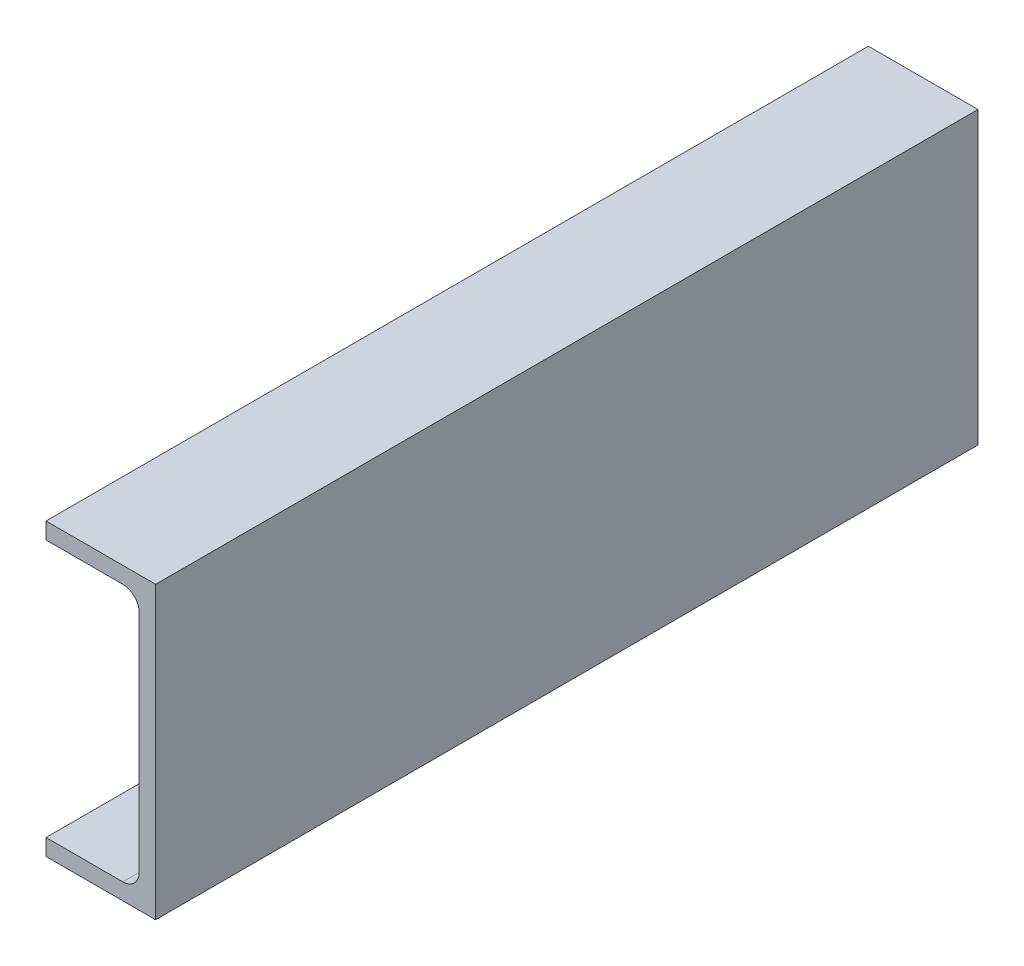
ISO-10303-21;
HEADER;
FILE_DESCRIPTION(('STEP AP214'),'2;1');
FILE_NAME('part.step','',(''),(''),'','','');
FILE_SCHEMA(('AUTOMOTIVE_DESIGN { 1 0 10303 214 1 1 1 1 }'));
ENDSEC;
DATA;
#1=APPLICATION_CONTEXT('core data for automotive mechanical design processes');
#2=APPLICATION_PROTOCOL_DEFINITION('international standard','automotive_design',2000,#1);
#3=PRODUCT_CONTEXT('',#1,'mechanical');
#4=PRODUCT('Part','Part','',(#3));
#5=PRODUCT_RELATED_PRODUCT_CATEGORY('part','',(#4));
#6=PRODUCT_DEFINITION_FORMATION('','',#4);
#7=PRODUCT_DEFINITION_CONTEXT('part definition',#1,'design');
#8=PRODUCT_DEFINITION('design','',#6,#7);
#9=PRODUCT_DEFINITION_SHAPE('','',#8);
#10=(LENGTH_UNIT() NAMED_UNIT(*) SI_UNIT(.MILLI.,.METRE.));
#11=(NAMED_UNIT(*) PLANE_ANGLE_UNIT() SI_UNIT($,.RADIAN.));
#12=(NAMED_UNIT(*) SI_UNIT($,.STERADIAN.) SOLID_ANGLE_UNIT());
#13=UNCERTAINTY_MEASURE_WITH_UNIT(LENGTH_MEASURE(1.E-05),#10,'distance_accuracy_value','');
#14=(GEOMETRIC_REPRESENTATION_CONTEXT(3) GLOBAL_UNCERTAINTY_ASSIGNED_CONTEXT((#13)) GLOBAL_UNIT_ASSIGNED_CONTEXT((#10,
#11,#12)) REPRESENTATION_CONTEXT('',''));
#15=CARTESIAN_POINT('',(0.,0.,0.));
#16=DIRECTION('',(0.,0.,1.));
#17=DIRECTION('',(1.,0.,0.));
#18=AXIS2_PLACEMENT_3D('',#15,#16,#17);
#19=CARTESIAN_POINT('',(20.,53.,75.));
#20=DIRECTION('',(0.,-1.,0.));
#21=DIRECTION('',(0.,0.,-1.));
#22=AXIS2_PLACEMENT_3D('',#19,#20,#21);
#23=PLANE('',#22);
#24=DIRECTION('',(-1.,0.,0.));
#25=VECTOR('',#24,1.);
#26=CARTESIAN_POINT('',(20.,53.,-75.));
#27=LINE('',#26,#25);
#28=CARTESIAN_POINT('',(20.,53.,-75.));
#29=VERTEX_POINT('',#28);
#30=CARTESIAN_POINT('',(0.,53.,-75.));
#31=VERTEX_POINT('',#30);
#32=EDGE_CURVE('E126',#29,#31,#27,.T.);
#33=ORIENTED_EDGE('',*,*,#32,.T.);
#34=DIRECTION('',(0.,0.,-1.));
#35=VECTOR('',#34,1.);
#36=CARTESIAN_POINT('',(0.,53.,75.));
#37=LINE('',#36,#35);
#38=CARTESIAN_POINT('',(0.,53.,75.));
#39=VERTEX_POINT('',#38);
#40=EDGE_CURVE('E124',#39,#31,#37,.T.);
#41=ORIENTED_EDGE('',*,*,#40,.F.);
#42=DIRECTION('',(-1.,0.,0.));
#43=VECTOR('',#42,1.);
#44=CARTESIAN_POINT('',(20.,53.,75.));
#45=LINE('',#44,#43);
#46=CARTESIAN_POINT('',(20.,53.,75.));
#47=VERTEX_POINT('',#46);
#48=EDGE_CURVE('E110',#47,#39,#45,.T.);
#49=ORIENTED_EDGE('',*,*,#48,.F.);
#50=DIRECTION('',(0.,0.,-1.));
#51=VECTOR('',#50,1.);
#52=CARTESIAN_POINT('',(20.,53.,75.));
#53=LINE('',#52,#51);
#54=EDGE_CURVE('E151',#47,#29,#53,.T.);
#55=ORIENTED_EDGE('',*,*,#54,.T.);
#56=EDGE_LOOP('',(#33,#41,#49,#55));
#57=FACE_BOUND('',#56,.T.);
#58=ADVANCED_FACE('F34',(#57),#23,.F.);
#59=CARTESIAN_POINT('',(0.,50.,75.));
#60=DIRECTION('',(-1.,0.,0.));
#61=DIRECTION('',(0.,0.,1.));
#62=AXIS2_PLACEMENT_3D('',#59,#60,#61);
#63=PLANE('',#62);
#64=DIRECTION('',(0.,1.,0.));
#65=VECTOR('',#64,1.);
#66=CARTESIAN_POINT('',(0.,50.,-75.));
#67=LINE('',#66,#65);
#68=CARTESIAN_POINT('',(0.,50.,-75.));
#69=VERTEX_POINT('',#68);
#70=EDGE_CURVE('E153',#69,#31,#67,.T.);
#71=ORIENTED_EDGE('',*,*,#70,.F.);
#72=DIRECTION('',(0.,0.,-1.));
#73=VECTOR('',#72,1.);
#74=CARTESIAN_POINT('',(0.,50.,75.));
#75=LINE('',#74,#73);
#76=CARTESIAN_POINT('',(0.,50.,75.));
#77=VERTEX_POINT('',#76);
#78=EDGE_CURVE('E131',#77,#69,#75,.T.);
#79=ORIENTED_EDGE('',*,*,#78,.F.);
#80=DIRECTION('',(0.,1.,0.));
#81=VECTOR('',#80,1.);
#82=CARTESIAN_POINT('',(0.,50.,75.));
#83=LINE('',#82,#81);
#84=EDGE_CURVE('E115',#77,#39,#83,.T.);
#85=ORIENTED_EDGE('',*,*,#84,.T.);
#86=ORIENTED_EDGE('',*,*,#40,.T.);
#87=EDGE_LOOP('',(#71,#79,#85,#86));
#88=FACE_BOUND('',#87,.T.);
#89=ADVANCED_FACE('F134',(#88),#63,.T.);
#90=CARTESIAN_POINT('',(20.,50.,75.));
#91=DIRECTION('',(0.,-1.,0.));
#92=DIRECTION('',(0.,0.,-1.));
#93=AXIS2_PLACEMENT_3D('',#90,#91,#92);
#94=PLANE('',#93);
#95=DIRECTION('',(1.,0.,0.));
#96=VECTOR('',#95,1.);
#97=CARTESIAN_POINT('',(20.,50.,-75.));
#98=LINE('',#97,#96);
#99=CARTESIAN_POINT('',(14.,50.,-75.));
#100=VERTEX_POINT('',#99);
#101=EDGE_CURVE('E155',#100,#69,#98,.F.);
#102=ORIENTED_EDGE('',*,*,#101,.F.);
#103=DIRECTION('',(0.,0.,-1.));
#104=VECTOR('',#103,1.);
#105=CARTESIAN_POINT('',(14.,50.,75.));
#106=LINE('',#105,#104);
#107=CARTESIAN_POINT('',(14.,50.,75.));
#108=VERTEX_POINT('',#107);
#109=EDGE_CURVE('E182',#100,#108,#106,.F.);
#110=ORIENTED_EDGE('',*,*,#109,.T.);
#111=DIRECTION('',(1.,0.,0.));
#112=VECTOR('',#111,1.);
#113=CARTESIAN_POINT('',(20.,50.,75.));
#114=LINE('',#113,#112);
#115=EDGE_CURVE('E136',#108,#77,#114,.F.);
#116=ORIENTED_EDGE('',*,*,#115,.T.);
#117=ORIENTED_EDGE('',*,*,#78,.T.);
#118=EDGE_LOOP('',(#102,#110,#116,#117));
#119=FACE_BOUND('',#118,.T.);
#120=ADVANCED_FACE('F213',(#119),#94,.T.);
#121=CARTESIAN_POINT('',(17.,0.,75.));
#122=DIRECTION('',(-1.,0.,0.));
#123=DIRECTION('',(0.,0.,1.));
#124=AXIS2_PLACEMENT_3D('',#121,#122,#123);
#125=PLANE('',#124);
#126=DIRECTION('',(0.,1.,0.));
#127=VECTOR('',#126,1.);
#128=CARTESIAN_POINT('',(17.,0.,75.));
#129=LINE('',#128,#127);
#130=CARTESIAN_POINT('',(17.,6.,75.));
#131=VERTEX_POINT('',#130);
#132=CARTESIAN_POINT('',(17.,47.,75.));
#133=VERTEX_POINT('',#132);
#134=EDGE_CURVE('E138',#131,#133,#129,.T.);
#135=ORIENTED_EDGE('',*,*,#134,.T.);
#136=DIRECTION('',(0.,0.,-1.));
#137=VECTOR('',#136,1.);
#138=CARTESIAN_POINT('',(17.,47.,-75.));
#139=LINE('',#138,#137);
#140=CARTESIAN_POINT('',(17.,47.,-75.));
#141=VERTEX_POINT('',#140);
#142=EDGE_CURVE('E179',#133,#141,#139,.T.);
#143=ORIENTED_EDGE('',*,*,#142,.T.);
#144=DIRECTION('',(0.,1.,0.));
#145=VECTOR('',#144,1.);
#146=CARTESIAN_POINT('',(17.,0.,-75.));
#147=LINE('',#146,#145);
#148=CARTESIAN_POINT('',(17.,6.,-75.));
#149=VERTEX_POINT('',#148);
#150=EDGE_CURVE('E157',#149,#141,#147,.T.);
#151=ORIENTED_EDGE('',*,*,#150,.F.);
#152=DIRECTION('',(0.,0.,-1.));
#153=VECTOR('',#152,1.);
#154=CARTESIAN_POINT('',(17.,6.,75.));
#155=LINE('',#154,#153);
#156=EDGE_CURVE('E130',#149,#131,#155,.F.);
#157=ORIENTED_EDGE('',*,*,#156,.T.);
#158=EDGE_LOOP('',(#135,#143,#151,#157));
#159=FACE_BOUND('',#158,.T.);
#160=ADVANCED_FACE('F194',(#159),#125,.T.);
#161=CARTESIAN_POINT('',(0.,3.,75.));
#162=DIRECTION('',(0.,1.,0.));
#163=DIRECTION('',(0.,0.,1.));
#164=AXIS2_PLACEMENT_3D('',#161,#162,#163);
#165=PLANE('',#164);
#166=DIRECTION('',(1.,0.,0.));
#167=VECTOR('',#166,1.);
#168=CARTESIAN_POINT('',(0.,3.,75.));
#169=LINE('',#168,#167);
#170=CARTESIAN_POINT('',(0.,3.,75.));
#171=VERTEX_POINT('',#170);
#172=CARTESIAN_POINT('',(14.,3.,75.));
#173=VERTEX_POINT('',#172);
#174=EDGE_CURVE('E143',#171,#173,#169,.T.);
#175=ORIENTED_EDGE('',*,*,#174,.T.);
#176=DIRECTION('',(0.,0.,-1.));
#177=VECTOR('',#176,1.);
#178=CARTESIAN_POINT('',(14.,3.,-75.));
#179=LINE('',#178,#177);
#180=CARTESIAN_POINT('',(14.,3.,-75.));
#181=VERTEX_POINT('',#180);
#182=EDGE_CURVE('E184',#173,#181,#179,.T.);
#183=ORIENTED_EDGE('',*,*,#182,.T.);
#184=DIRECTION('',(1.,0.,0.));
#185=VECTOR('',#184,1.);
#186=CARTESIAN_POINT('',(0.,3.,-75.));
#187=LINE('',#186,#185);
#188=CARTESIAN_POINT('',(0.,3.,-75.));
#189=VERTEX_POINT('',#188);
#190=EDGE_CURVE('E160',#189,#181,#187,.T.);
#191=ORIENTED_EDGE('',*,*,#190,.F.);
#192=DIRECTION('',(0.,0.,-1.));
#193=VECTOR('',#192,1.);
#194=CARTESIAN_POINT('',(0.,3.,75.));
#195=LINE('',#194,#193);
#196=EDGE_CURVE('E175',#171,#189,#195,.T.);
#197=ORIENTED_EDGE('',*,*,#196,.F.);
#198=EDGE_LOOP('',(#175,#183,#191,#197));
#199=FACE_BOUND('',#198,.T.);
#200=ADVANCED_FACE('F197',(#199),#165,.T.);
#201=CARTESIAN_POINT('',(0.,0.,75.));
#202=DIRECTION('',(-1.,0.,0.));
#203=DIRECTION('',(0.,0.,1.));
#204=AXIS2_PLACEMENT_3D('',#201,#202,#203);
#205=PLANE('',#204);
#206=DIRECTION('',(0.,1.,0.));
#207=VECTOR('',#206,1.);
#208=CARTESIAN_POINT('',(0.,0.,-75.));
#209=LINE('',#208,#207);
#210=CARTESIAN_POINT('',(0.,0.,-75.));
#211=VERTEX_POINT('',#210);
#212=EDGE_CURVE('E163',#211,#189,#209,.T.);
#213=ORIENTED_EDGE('',*,*,#212,.F.);
#214=DIRECTION('',(0.,0.,-1.));
#215=VECTOR('',#214,1.);
#216=CARTESIAN_POINT('',(0.,0.,75.));
#217=LINE('',#216,#215);
#218=CARTESIAN_POINT('',(0.,0.,75.));
#219=VERTEX_POINT('',#218);
#220=EDGE_CURVE('E173',#219,#211,#217,.T.);
#221=ORIENTED_EDGE('',*,*,#220,.F.);
#222=DIRECTION('',(0.,1.,0.));
#223=VECTOR('',#222,1.);
#224=CARTESIAN_POINT('',(0.,0.,75.));
#225=LINE('',#224,#223);
#226=EDGE_CURVE('E145',#219,#171,#225,.T.);
#227=ORIENTED_EDGE('',*,*,#226,.T.);
#228=ORIENTED_EDGE('',*,*,#196,.T.);
#229=EDGE_LOOP('',(#213,#221,#227,#228));
#230=FACE_BOUND('',#229,.T.);
#231=ADVANCED_FACE('F201',(#230),#205,.T.);
#232=CARTESIAN_POINT('',(0.,0.,75.));
#233=DIRECTION('',(0.,1.,0.));
#234=DIRECTION('',(0.,0.,1.));
#235=AXIS2_PLACEMENT_3D('',#232,#233,#234);
#236=PLANE('',#235);
#237=DIRECTION('',(1.,0.,0.));
#238=VECTOR('',#237,1.);
#239=CARTESIAN_POINT('',(0.,0.,-75.));
#240=LINE('',#239,#238);
#241=CARTESIAN_POINT('',(20.,0.,-75.));
#242=VERTEX_POINT('',#241);
#243=EDGE_CURVE('E166',#211,#242,#240,.T.);
#244=ORIENTED_EDGE('',*,*,#243,.T.);
#245=DIRECTION('',(0.,0.,-1.));
#246=VECTOR('',#245,1.);
#247=CARTESIAN_POINT('',(20.,0.,75.));
#248=LINE('',#247,#246);
#249=CARTESIAN_POINT('',(20.,0.,75.));
#250=VERTEX_POINT('',#249);
#251=EDGE_CURVE('E170',#250,#242,#248,.T.);
#252=ORIENTED_EDGE('',*,*,#251,.F.);
#253=DIRECTION('',(1.,0.,0.));
#254=VECTOR('',#253,1.);
#255=CARTESIAN_POINT('',(0.,0.,75.));
#256=LINE('',#255,#254);
#257=EDGE_CURVE('E148',#219,#250,#256,.T.);
#258=ORIENTED_EDGE('',*,*,#257,.F.);
#259=ORIENTED_EDGE('',*,*,#220,.T.);
#260=EDGE_LOOP('',(#244,#252,#258,#259));
#261=FACE_BOUND('',#260,.T.);
#262=ADVANCED_FACE('F206',(#261),#236,.F.);
#263=CARTESIAN_POINT('',(20.,0.,75.));
#264=DIRECTION('',(-1.,0.,0.));
#265=DIRECTION('',(0.,0.,1.));
#266=AXIS2_PLACEMENT_3D('',#263,#264,#265);
#267=PLANE('',#266);
#268=DIRECTION('',(0.,1.,0.));
#269=VECTOR('',#268,1.);
#270=CARTESIAN_POINT('',(20.,0.,-75.));
#271=LINE('',#270,#269);
#272=EDGE_CURVE('E121',#242,#29,#271,.T.);
#273=ORIENTED_EDGE('',*,*,#272,.T.);
#274=ORIENTED_EDGE('',*,*,#54,.F.);
#275=DIRECTION('',(0.,1.,0.));
#276=VECTOR('',#275,1.);
#277=CARTESIAN_POINT('',(20.,0.,75.));
#278=LINE('',#277,#276);
#279=EDGE_CURVE('E117',#250,#47,#278,.T.);
#280=ORIENTED_EDGE('',*,*,#279,.F.);
#281=ORIENTED_EDGE('',*,*,#251,.T.);
#282=EDGE_LOOP('',(#273,#274,#280,#281));
#283=FACE_BOUND('',#282,.T.);
#284=ADVANCED_FACE('F209',(#283),#267,.F.);
#285=CARTESIAN_POINT('',(0.,0.,75.));
#286=DIRECTION('',(0.,0.,-1.));
#287=DIRECTION('',(-1.,0.,0.));
#288=AXIS2_PLACEMENT_3D('',#285,#286,#287);
#289=PLANE('',#288);
#290=ORIENTED_EDGE('',*,*,#48,.T.);
#291=ORIENTED_EDGE('',*,*,#84,.F.);
#292=ORIENTED_EDGE('',*,*,#115,.F.);
#293=CARTESIAN_POINT('',(14.,47.,75.));
#294=DIRECTION('',(0.,0.,-1.));
#295=DIRECTION('',(-1.,0.,0.));
#296=AXIS2_PLACEMENT_3D('',#293,#294,#295);
#297=CIRCLE('',#296,3.);
#298=EDGE_CURVE('E188',#108,#133,#297,.T.);
#299=ORIENTED_EDGE('',*,*,#298,.T.);
#300=ORIENTED_EDGE('',*,*,#134,.F.);
#301=CARTESIAN_POINT('',(14.,6.,75.));
#302=DIRECTION('',(0.,0.,-1.));
#303=DIRECTION('',(-1.,0.,0.));
#304=AXIS2_PLACEMENT_3D('',#301,#302,#303);
#305=CIRCLE('',#304,3.);
#306=EDGE_CURVE('E11',#131,#173,#305,.T.);
#307=ORIENTED_EDGE('',*,*,#306,.T.);
#308=ORIENTED_EDGE('',*,*,#174,.F.);
#309=ORIENTED_EDGE('',*,*,#226,.F.);
#310=ORIENTED_EDGE('',*,*,#257,.T.);
#311=ORIENTED_EDGE('',*,*,#279,.T.);
#312=EDGE_LOOP('',(#290,#291,#292,#299,#300,#307,#308,#309,#310,#311));
#313=FACE_BOUND('',#312,.T.);
#314=ADVANCED_FACE('F112',(#313),#289,.F.);
#315=CARTESIAN_POINT('',(0.,0.,-75.));
#316=DIRECTION('',(0.,0.,-1.));
#317=DIRECTION('',(-1.,0.,0.));
#318=AXIS2_PLACEMENT_3D('',#315,#316,#317);
#319=PLANE('',#318);
#320=ORIENTED_EDGE('',*,*,#32,.F.);
#321=ORIENTED_EDGE('',*,*,#272,.F.);
#322=ORIENTED_EDGE('',*,*,#243,.F.);
#323=ORIENTED_EDGE('',*,*,#212,.T.);
#324=ORIENTED_EDGE('',*,*,#190,.T.);
#325=CARTESIAN_POINT('',(14.,6.,-75.));
#326=DIRECTION('',(0.,0.,-1.));
#327=DIRECTION('',(-1.,0.,0.));
#328=AXIS2_PLACEMENT_3D('',#325,#326,#327);
#329=CIRCLE('',#328,3.);
#330=EDGE_CURVE('E42',#181,#149,#329,.F.);
#331=ORIENTED_EDGE('',*,*,#330,.T.);
#332=ORIENTED_EDGE('',*,*,#150,.T.);
#333=CARTESIAN_POINT('',(14.,47.,-75.));
#334=DIRECTION('',(0.,0.,-1.));
#335=DIRECTION('',(-1.,0.,0.));
#336=AXIS2_PLACEMENT_3D('',#333,#334,#335);
#337=CIRCLE('',#336,3.);
#338=EDGE_CURVE('E186',#141,#100,#337,.F.);
#339=ORIENTED_EDGE('',*,*,#338,.T.);
#340=ORIENTED_EDGE('',*,*,#101,.T.);
#341=ORIENTED_EDGE('',*,*,#70,.T.);
#342=EDGE_LOOP('',(#320,#321,#322,#323,#324,#331,#332,#339,#340,#341));
#343=FACE_BOUND('',#342,.T.);
#344=ADVANCED_FACE('F191',(#343),#319,.T.);
#345=CARTESIAN_POINT('',(14.,47.,75.));
#346=DIRECTION('',(0.,0.,1.));
#347=DIRECTION('',(1.,0.,0.));
#348=AXIS2_PLACEMENT_3D('',#345,#346,#347);
#349=CYLINDRICAL_SURFACE('',#348,3.);
#350=ORIENTED_EDGE('',*,*,#298,.F.);
#351=ORIENTED_EDGE('',*,*,#109,.F.);
#352=ORIENTED_EDGE('',*,*,#338,.F.);
#353=ORIENTED_EDGE('',*,*,#142,.F.);
#354=EDGE_LOOP('',(#350,#351,#352,#353));
#355=FACE_BOUND('',#354,.T.);
#356=ADVANCED_FACE('F216',(#355),#349,.F.);
#357=CARTESIAN_POINT('',(14.,6.,75.));
#358=DIRECTION('',(0.,0.,1.));
#359=DIRECTION('',(1.,0.,0.));
#360=AXIS2_PLACEMENT_3D('',#357,#358,#359);
#361=CYLINDRICAL_SURFACE('',#360,3.);
#362=ORIENTED_EDGE('',*,*,#306,.F.);
#363=ORIENTED_EDGE('',*,*,#156,.F.);
#364=ORIENTED_EDGE('',*,*,#330,.F.);
#365=ORIENTED_EDGE('',*,*,#182,.F.);
#366=EDGE_LOOP('',(#362,#363,#364,#365));
#367=FACE_BOUND('',#366,.T.);
#368=ADVANCED_FACE('F36',(#367),#361,.F.);
#369=CLOSED_SHELL('',(#58,#89,#120,#160,#200,#231,#262,#284,#314,#344,#356,#368));
#370=MANIFOLD_SOLID_BREP('B2',#369);
#371=ADVANCED_BREP_SHAPE_REPRESENTATION('',(#18,#370),#14);
#372=SHAPE_DEFINITION_REPRESENTATION(#9,#371);
ENDSEC;
END-ISO-10303-21;
